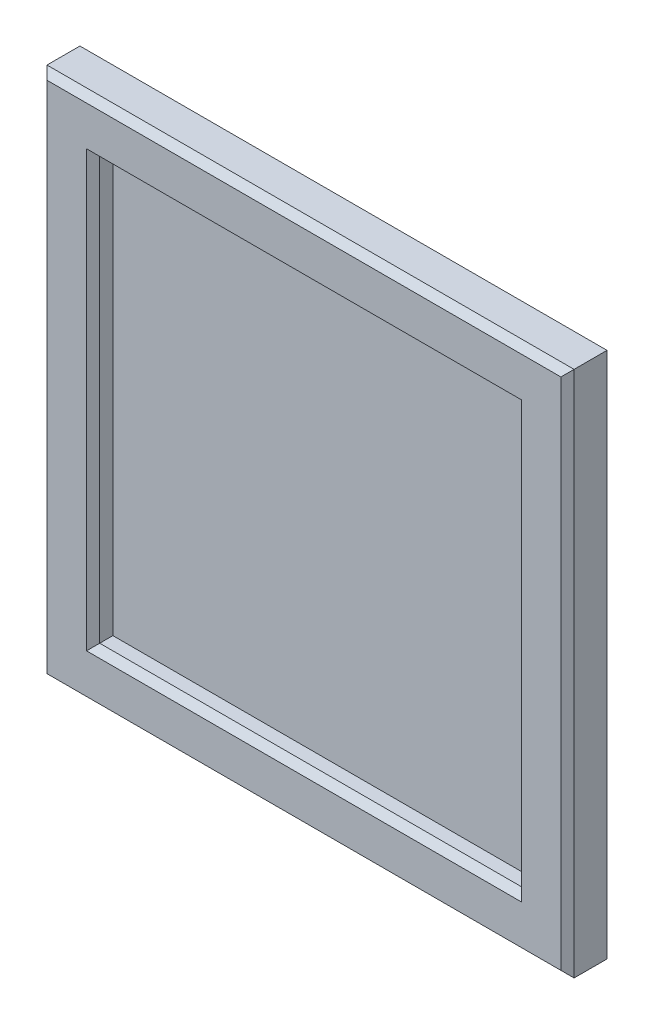
ISO-10303-21;
HEADER;
FILE_DESCRIPTION(('STEP AP214'),'2;1');
FILE_NAME('part.step','',(''),(''),'','','');
FILE_SCHEMA(('AUTOMOTIVE_DESIGN { 1 0 10303 214 1 1 1 1 }'));
ENDSEC;
DATA;
#1=APPLICATION_CONTEXT('core data for automotive mechanical design processes');
#2=APPLICATION_PROTOCOL_DEFINITION('international standard','automotive_design',2000,#1);
#3=PRODUCT_CONTEXT('',#1,'mechanical');
#4=PRODUCT('Part','Part','',(#3));
#5=PRODUCT_RELATED_PRODUCT_CATEGORY('part','',(#4));
#6=PRODUCT_DEFINITION_FORMATION('','',#4);
#7=PRODUCT_DEFINITION_CONTEXT('part definition',#1,'design');
#8=PRODUCT_DEFINITION('design','',#6,#7);
#9=PRODUCT_DEFINITION_SHAPE('','',#8);
#10=(LENGTH_UNIT() NAMED_UNIT(*) SI_UNIT(.MILLI.,.METRE.));
#11=(NAMED_UNIT(*) PLANE_ANGLE_UNIT() SI_UNIT($,.RADIAN.));
#12=(NAMED_UNIT(*) SI_UNIT($,.STERADIAN.) SOLID_ANGLE_UNIT());
#13=UNCERTAINTY_MEASURE_WITH_UNIT(LENGTH_MEASURE(1.E-05),#10,'distance_accuracy_value','');
#14=(GEOMETRIC_REPRESENTATION_CONTEXT(3) GLOBAL_UNCERTAINTY_ASSIGNED_CONTEXT((#13)) GLOBAL_UNIT_ASSIGNED_CONTEXT((#10,
#11,#12)) REPRESENTATION_CONTEXT('',''));
#15=CARTESIAN_POINT('',(0.,0.,0.));
#16=DIRECTION('',(0.,0.,1.));
#17=DIRECTION('',(1.,0.,0.));
#18=AXIS2_PLACEMENT_3D('',#15,#16,#17);
#19=CARTESIAN_POINT('',(752.924621398334,752.055348931836,30.));
#20=DIRECTION('',(1.,0.,0.));
#21=DIRECTION('',(0.,0.,-1.));
#22=AXIS2_PLACEMENT_3D('',#19,#20,#21);
#23=PLANE('',#22);
#24=DIRECTION('',(0.,-1.,0.));
#25=VECTOR('',#24,1.);
#26=CARTESIAN_POINT('',(752.924621398334,752.055348931836,20.));
#27=LINE('',#26,#25);
#28=CARTESIAN_POINT('',(752.924621398334,752.055348931836,20.));
#29=VERTEX_POINT('',#28);
#30=CARTESIAN_POINT('',(752.924621398334,37.5133814701847,20.));
#31=VERTEX_POINT('',#30);
#32=EDGE_CURVE('E121',#29,#31,#27,.T.);
#33=ORIENTED_EDGE('',*,*,#32,.F.);
#34=DIRECTION('',(0.,0.,-1.));
#35=VECTOR('',#34,1.);
#36=CARTESIAN_POINT('',(752.924621398334,752.055348931836,30.));
#37=LINE('',#36,#35);
#38=CARTESIAN_POINT('',(752.924621398334,752.055348931836,30.));
#39=VERTEX_POINT('',#38);
#40=EDGE_CURVE('E12',#39,#29,#37,.T.);
#41=ORIENTED_EDGE('',*,*,#40,.F.);
#42=DIRECTION('',(0.,-1.,0.));
#43=VECTOR('',#42,1.);
#44=CARTESIAN_POINT('',(752.924621398334,752.055348931836,30.));
#45=LINE('',#44,#43);
#46=CARTESIAN_POINT('',(752.924621398334,37.5133814701847,30.));
#47=VERTEX_POINT('',#46);
#48=EDGE_CURVE('E115',#39,#47,#45,.T.);
#49=ORIENTED_EDGE('',*,*,#48,.T.);
#50=DIRECTION('',(0.,0.,-1.));
#51=VECTOR('',#50,1.);
#52=CARTESIAN_POINT('',(752.924621398334,37.5133814701847,30.));
#53=LINE('',#52,#51);
#54=EDGE_CURVE('E60',#47,#31,#53,.T.);
#55=ORIENTED_EDGE('',*,*,#54,.T.);
#56=EDGE_LOOP('',(#33,#41,#49,#55));
#57=FACE_BOUND('',#56,.T.);
#58=ADVANCED_FACE('F57',(#57),#23,.T.);
#59=CARTESIAN_POINT('',(752.924621398334,752.055348931836,30.));
#60=DIRECTION('',(0.,1.,0.));
#61=DIRECTION('',(0.,0.,1.));
#62=AXIS2_PLACEMENT_3D('',#59,#60,#61);
#63=PLANE('',#62);
#64=DIRECTION('',(1.,0.,0.));
#65=VECTOR('',#64,1.);
#66=CARTESIAN_POINT('',(752.924621398334,752.055348931836,20.));
#67=LINE('',#66,#65);
#68=CARTESIAN_POINT('',(41.8597438026764,752.055348931836,20.));
#69=VERTEX_POINT('',#68);
#70=EDGE_CURVE('E117',#69,#29,#67,.T.);
#71=ORIENTED_EDGE('',*,*,#70,.F.);
#72=DIRECTION('',(0.,0.,-1.));
#73=VECTOR('',#72,1.);
#74=CARTESIAN_POINT('',(41.8597438026764,752.055348931836,30.));
#75=LINE('',#74,#73);
#76=CARTESIAN_POINT('',(41.8597438026764,752.055348931836,30.));
#77=VERTEX_POINT('',#76);
#78=EDGE_CURVE('E66',#77,#69,#75,.T.);
#79=ORIENTED_EDGE('',*,*,#78,.F.);
#80=DIRECTION('',(1.,0.,0.));
#81=VECTOR('',#80,1.);
#82=CARTESIAN_POINT('',(752.924621398334,752.055348931836,30.));
#83=LINE('',#82,#81);
#84=EDGE_CURVE('E112',#77,#39,#83,.T.);
#85=ORIENTED_EDGE('',*,*,#84,.T.);
#86=ORIENTED_EDGE('',*,*,#40,.T.);
#87=EDGE_LOOP('',(#71,#79,#85,#86));
#88=FACE_BOUND('',#87,.T.);
#89=ADVANCED_FACE('F131',(#88),#63,.T.);
#90=CARTESIAN_POINT('',(41.8597438026764,752.055348931836,30.));
#91=DIRECTION('',(-1.,0.,0.));
#92=DIRECTION('',(0.,0.,1.));
#93=AXIS2_PLACEMENT_3D('',#90,#91,#92);
#94=PLANE('',#93);
#95=DIRECTION('',(0.,1.,0.));
#96=VECTOR('',#95,1.);
#97=CARTESIAN_POINT('',(41.8597438026764,752.055348931836,20.));
#98=LINE('',#97,#96);
#99=CARTESIAN_POINT('',(41.8597438026764,37.5133814701847,20.));
#100=VERTEX_POINT('',#99);
#101=EDGE_CURVE('E107',#100,#69,#98,.T.);
#102=ORIENTED_EDGE('',*,*,#101,.F.);
#103=DIRECTION('',(0.,0.,-1.));
#104=VECTOR('',#103,1.);
#105=CARTESIAN_POINT('',(41.8597438026764,37.5133814701847,30.));
#106=LINE('',#105,#104);
#107=CARTESIAN_POINT('',(41.8597438026764,37.5133814701847,30.));
#108=VERTEX_POINT('',#107);
#109=EDGE_CURVE('E102',#108,#100,#106,.T.);
#110=ORIENTED_EDGE('',*,*,#109,.F.);
#111=DIRECTION('',(0.,1.,0.));
#112=VECTOR('',#111,1.);
#113=CARTESIAN_POINT('',(41.8597438026764,752.055348931836,30.));
#114=LINE('',#113,#112);
#115=EDGE_CURVE('E105',#108,#77,#114,.T.);
#116=ORIENTED_EDGE('',*,*,#115,.T.);
#117=ORIENTED_EDGE('',*,*,#78,.T.);
#118=EDGE_LOOP('',(#102,#110,#116,#117));
#119=FACE_BOUND('',#118,.T.);
#120=ADVANCED_FACE('F104',(#119),#94,.T.);
#121=CARTESIAN_POINT('',(752.924621398334,37.5133814701847,30.));
#122=DIRECTION('',(0.,-1.,0.));
#123=DIRECTION('',(0.,0.,-1.));
#124=AXIS2_PLACEMENT_3D('',#121,#122,#123);
#125=PLANE('',#124);
#126=DIRECTION('',(-1.,0.,0.));
#127=VECTOR('',#126,1.);
#128=CARTESIAN_POINT('',(752.924621398334,37.5133814701847,20.));
#129=LINE('',#128,#127);
#130=EDGE_CURVE('E124',#31,#100,#129,.T.);
#131=ORIENTED_EDGE('',*,*,#130,.F.);
#132=ORIENTED_EDGE('',*,*,#54,.F.);
#133=DIRECTION('',(-1.,0.,0.));
#134=VECTOR('',#133,1.);
#135=CARTESIAN_POINT('',(752.924621398334,37.5133814701847,30.));
#136=LINE('',#135,#134);
#137=EDGE_CURVE('E111',#47,#108,#136,.T.);
#138=ORIENTED_EDGE('',*,*,#137,.T.);
#139=ORIENTED_EDGE('',*,*,#109,.T.);
#140=EDGE_LOOP('',(#131,#132,#138,#139));
#141=FACE_BOUND('',#140,.T.);
#142=ADVANCED_FACE('F114',(#141),#125,.T.);
#143=CARTESIAN_POINT('',(0.,0.,30.));
#144=DIRECTION('',(0.,0.,-1.));
#145=DIRECTION('',(-1.,0.,0.));
#146=AXIS2_PLACEMENT_3D('',#143,#144,#145);
#147=PLANE('',#146);
#148=ORIENTED_EDGE('',*,*,#48,.F.);
#149=ORIENTED_EDGE('',*,*,#84,.F.);
#150=ORIENTED_EDGE('',*,*,#115,.F.);
#151=ORIENTED_EDGE('',*,*,#137,.F.);
#152=EDGE_LOOP('',(#148,#149,#150,#151));
#153=FACE_BOUND('',#152,.T.);
#154=ADVANCED_FACE('F110',(#153),#147,.F.);
#155=CARTESIAN_POINT('',(0.,0.,20.));
#156=DIRECTION('',(0.,0.,-1.));
#157=DIRECTION('',(-1.,0.,0.));
#158=AXIS2_PLACEMENT_3D('',#155,#156,#157);
#159=PLANE('',#158);
#160=ORIENTED_EDGE('',*,*,#32,.T.);
#161=ORIENTED_EDGE('',*,*,#130,.T.);
#162=ORIENTED_EDGE('',*,*,#101,.T.);
#163=ORIENTED_EDGE('',*,*,#70,.T.);
#164=EDGE_LOOP('',(#160,#161,#162,#163));
#165=FACE_BOUND('',#164,.T.);
#166=ADVANCED_FACE('F130',(#165),#159,.T.);
#167=CLOSED_SHELL('',(#58,#89,#120,#142,#154,#166));
#168=MANIFOLD_SOLID_BREP('B2',#167);
#169=CARTESIAN_POINT('',(0.,0.,60.));
#170=DIRECTION('',(0.,0.,-1.));
#171=DIRECTION('',(-1.,0.,0.));
#172=AXIS2_PLACEMENT_3D('',#169,#170,#171);
#173=PLANE('',#172);
#174=DIRECTION('',(1.,0.,0.));
#175=VECTOR('',#174,1.);
#176=CARTESIAN_POINT('',(720.,730.,60.));
#177=LINE('',#176,#175);
#178=CARTESIAN_POINT('',(70.,730.,60.));
#179=VERTEX_POINT('',#178);
#180=CARTESIAN_POINT('',(730.,730.,60.));
#181=VERTEX_POINT('',#180);
#182=EDGE_CURVE('E346',#179,#181,#177,.T.);
#183=ORIENTED_EDGE('',*,*,#182,.T.);
#184=DIRECTION('',(0.,-1.,0.));
#185=VECTOR('',#184,1.);
#186=CARTESIAN_POINT('',(730.,80.,60.));
#187=LINE('',#186,#185);
#188=CARTESIAN_POINT('',(730.,70.,60.));
#189=VERTEX_POINT('',#188);
#190=EDGE_CURVE('E348',#181,#189,#187,.T.);
#191=ORIENTED_EDGE('',*,*,#190,.T.);
#192=DIRECTION('',(-1.,0.,0.));
#193=VECTOR('',#192,1.);
#194=CARTESIAN_POINT('',(80.,70.,60.));
#195=LINE('',#194,#193);
#196=CARTESIAN_POINT('',(70.,70.,60.));
#197=VERTEX_POINT('',#196);
#198=EDGE_CURVE('E342',#189,#197,#195,.T.);
#199=ORIENTED_EDGE('',*,*,#198,.T.);
#200=DIRECTION('',(0.,1.,0.));
#201=VECTOR('',#200,1.);
#202=CARTESIAN_POINT('',(70.,720.,60.));
#203=LINE('',#202,#201);
#204=EDGE_CURVE('E344',#197,#179,#203,.T.);
#205=ORIENTED_EDGE('',*,*,#204,.T.);
#206=EDGE_LOOP('',(#183,#191,#199,#205));
#207=FACE_BOUND('',#206,.T.);
#208=DIRECTION('',(0.,1.,0.));
#209=VECTOR('',#208,1.);
#210=CARTESIAN_POINT('',(790.,0.,60.));
#211=LINE('',#210,#209);
#212=CARTESIAN_POINT('',(790.,10.,60.));
#213=VERTEX_POINT('',#212);
#214=CARTESIAN_POINT('',(790.,790.,60.));
#215=VERTEX_POINT('',#214);
#216=EDGE_CURVE('E337',#213,#215,#211,.T.);
#217=ORIENTED_EDGE('',*,*,#216,.T.);
#218=DIRECTION('',(-1.,0.,0.));
#219=VECTOR('',#218,1.);
#220=CARTESIAN_POINT('',(0.,790.,60.));
#221=LINE('',#220,#219);
#222=CARTESIAN_POINT('',(10.,790.,60.));
#223=VERTEX_POINT('',#222);
#224=EDGE_CURVE('E339',#215,#223,#221,.T.);
#225=ORIENTED_EDGE('',*,*,#224,.T.);
#226=DIRECTION('',(0.,-1.,0.));
#227=VECTOR('',#226,1.);
#228=CARTESIAN_POINT('',(10.,0.,60.));
#229=LINE('',#228,#227);
#230=CARTESIAN_POINT('',(10.,10.,60.));
#231=VERTEX_POINT('',#230);
#232=EDGE_CURVE('E333',#223,#231,#229,.T.);
#233=ORIENTED_EDGE('',*,*,#232,.T.);
#234=DIRECTION('',(1.,0.,0.));
#235=VECTOR('',#234,1.);
#236=CARTESIAN_POINT('',(0.,10.,60.));
#237=LINE('',#236,#235);
#238=EDGE_CURVE('E335',#231,#213,#237,.T.);
#239=ORIENTED_EDGE('',*,*,#238,.T.);
#240=EDGE_LOOP('',(#217,#225,#233,#239));
#241=FACE_BOUND('',#240,.T.);
#242=ADVANCED_FACE('F181',(#207,#241),#173,.F.);
#243=CARTESIAN_POINT('',(0.,0.,0.));
#244=DIRECTION('',(0.,0.,-1.));
#245=DIRECTION('',(-1.,0.,0.));
#246=AXIS2_PLACEMENT_3D('',#243,#244,#245);
#247=PLANE('',#246);
#248=DIRECTION('',(0.,-1.,0.));
#249=VECTOR('',#248,1.);
#250=CARTESIAN_POINT('',(0.,0.,0.));
#251=LINE('',#250,#249);
#252=CARTESIAN_POINT('',(0.,800.,0.));
#253=VERTEX_POINT('',#252);
#254=CARTESIAN_POINT('',(0.,0.,0.));
#255=VERTEX_POINT('',#254);
#256=EDGE_CURVE('E284',#253,#255,#251,.T.);
#257=ORIENTED_EDGE('',*,*,#256,.F.);
#258=DIRECTION('',(-1.,0.,0.));
#259=VECTOR('',#258,1.);
#260=CARTESIAN_POINT('',(0.,800.,0.));
#261=LINE('',#260,#259);
#262=CARTESIAN_POINT('',(800.,800.,0.));
#263=VERTEX_POINT('',#262);
#264=EDGE_CURVE('E320',#263,#253,#261,.T.);
#265=ORIENTED_EDGE('',*,*,#264,.F.);
#266=DIRECTION('',(0.,1.,0.));
#267=VECTOR('',#266,1.);
#268=CARTESIAN_POINT('',(800.,0.,0.));
#269=LINE('',#268,#267);
#270=CARTESIAN_POINT('',(800.,0.,0.));
#271=VERTEX_POINT('',#270);
#272=EDGE_CURVE('E317',#271,#263,#269,.T.);
#273=ORIENTED_EDGE('',*,*,#272,.F.);
#274=DIRECTION('',(1.,0.,0.));
#275=VECTOR('',#274,1.);
#276=CARTESIAN_POINT('',(0.,0.,0.));
#277=LINE('',#276,#275);
#278=EDGE_CURVE('E314',#255,#271,#277,.T.);
#279=ORIENTED_EDGE('',*,*,#278,.F.);
#280=EDGE_LOOP('',(#257,#265,#273,#279));
#281=FACE_BOUND('',#280,.T.);
#282=DIRECTION('',(0.,-1.,0.));
#283=VECTOR('',#282,1.);
#284=CARTESIAN_POINT('',(80.,80.,0.));
#285=LINE('',#284,#283);
#286=CARTESIAN_POINT('',(80.,720.,0.));
#287=VERTEX_POINT('',#286);
#288=CARTESIAN_POINT('',(80.,80.,0.));
#289=VERTEX_POINT('',#288);
#290=EDGE_CURVE('E298',#287,#289,#285,.T.);
#291=ORIENTED_EDGE('',*,*,#290,.T.);
#292=DIRECTION('',(1.,0.,0.));
#293=VECTOR('',#292,1.);
#294=CARTESIAN_POINT('',(80.,80.,0.));
#295=LINE('',#294,#293);
#296=CARTESIAN_POINT('',(720.,80.,0.));
#297=VERTEX_POINT('',#296);
#298=EDGE_CURVE('E277',#289,#297,#295,.T.);
#299=ORIENTED_EDGE('',*,*,#298,.T.);
#300=DIRECTION('',(0.,1.,0.));
#301=VECTOR('',#300,1.);
#302=CARTESIAN_POINT('',(720.,80.,0.));
#303=LINE('',#302,#301);
#304=CARTESIAN_POINT('',(720.,720.,0.));
#305=VERTEX_POINT('',#304);
#306=EDGE_CURVE('E288',#297,#305,#303,.T.);
#307=ORIENTED_EDGE('',*,*,#306,.T.);
#308=DIRECTION('',(-1.,0.,0.));
#309=VECTOR('',#308,1.);
#310=CARTESIAN_POINT('',(80.,720.,0.));
#311=LINE('',#310,#309);
#312=EDGE_CURVE('E294',#305,#287,#311,.T.);
#313=ORIENTED_EDGE('',*,*,#312,.T.);
#314=EDGE_LOOP('',(#291,#299,#307,#313));
#315=FACE_BOUND('',#314,.T.);
#316=ADVANCED_FACE('F296',(#281,#315),#247,.T.);
#317=CARTESIAN_POINT('',(0.,0.,60.));
#318=DIRECTION('',(1.,0.,0.));
#319=DIRECTION('',(0.,0.,-1.));
#320=AXIS2_PLACEMENT_3D('',#317,#318,#319);
#321=PLANE('',#320);
#322=DIRECTION('',(0.,0.,-1.));
#323=VECTOR('',#322,1.);
#324=CARTESIAN_POINT('',(0.,0.,60.));
#325=LINE('',#324,#323);
#326=CARTESIAN_POINT('',(0.,0.,49.9999999999999));
#327=VERTEX_POINT('',#326);
#328=EDGE_CURVE('E329',#327,#255,#325,.T.);
#329=ORIENTED_EDGE('',*,*,#328,.F.);
#330=DIRECTION('',(0.,1.,0.));
#331=VECTOR('',#330,1.);
#332=CARTESIAN_POINT('',(0.,0.,49.9999999999999));
#333=LINE('',#332,#331);
#334=CARTESIAN_POINT('',(0.,800.,49.9999999999999));
#335=VERTEX_POINT('',#334);
#336=EDGE_CURVE('E55',#327,#335,#333,.T.);
#337=ORIENTED_EDGE('',*,*,#336,.T.);
#338=DIRECTION('',(0.,0.,-1.));
#339=VECTOR('',#338,1.);
#340=CARTESIAN_POINT('',(0.,800.,60.));
#341=LINE('',#340,#339);
#342=EDGE_CURVE('E323',#335,#253,#341,.T.);
#343=ORIENTED_EDGE('',*,*,#342,.T.);
#344=ORIENTED_EDGE('',*,*,#256,.T.);
#345=EDGE_LOOP('',(#329,#337,#343,#344));
#346=FACE_BOUND('',#345,.T.);
#347=ADVANCED_FACE('F388',(#346),#321,.F.);
#348=CARTESIAN_POINT('',(0.,0.,60.));
#349=DIRECTION('',(0.,1.,0.));
#350=DIRECTION('',(0.,0.,1.));
#351=AXIS2_PLACEMENT_3D('',#348,#349,#350);
#352=PLANE('',#351);
#353=DIRECTION('',(0.,0.,-1.));
#354=VECTOR('',#353,1.);
#355=CARTESIAN_POINT('',(800.,0.,60.));
#356=LINE('',#355,#354);
#357=CARTESIAN_POINT('',(800.,0.,49.9999999999999));
#358=VERTEX_POINT('',#357);
#359=EDGE_CURVE('E327',#358,#271,#356,.T.);
#360=ORIENTED_EDGE('',*,*,#359,.F.);
#361=DIRECTION('',(-1.,0.,0.));
#362=VECTOR('',#361,1.);
#363=CARTESIAN_POINT('',(0.,0.,49.9999999999999));
#364=LINE('',#363,#362);
#365=EDGE_CURVE('E191',#358,#327,#364,.T.);
#366=ORIENTED_EDGE('',*,*,#365,.T.);
#367=ORIENTED_EDGE('',*,*,#328,.T.);
#368=ORIENTED_EDGE('',*,*,#278,.T.);
#369=EDGE_LOOP('',(#360,#366,#367,#368));
#370=FACE_BOUND('',#369,.T.);
#371=ADVANCED_FACE('F415',(#370),#352,.F.);
#372=CARTESIAN_POINT('',(800.,0.,60.));
#373=DIRECTION('',(-1.,0.,0.));
#374=DIRECTION('',(0.,0.,1.));
#375=AXIS2_PLACEMENT_3D('',#372,#373,#374);
#376=PLANE('',#375);
#377=DIRECTION('',(0.,0.,-1.));
#378=VECTOR('',#377,1.);
#379=CARTESIAN_POINT('',(800.,800.,60.));
#380=LINE('',#379,#378);
#381=CARTESIAN_POINT('',(800.,800.,49.9999999999999));
#382=VERTEX_POINT('',#381);
#383=EDGE_CURVE('E325',#382,#263,#380,.T.);
#384=ORIENTED_EDGE('',*,*,#383,.F.);
#385=DIRECTION('',(0.,-1.,0.));
#386=VECTOR('',#385,1.);
#387=CARTESIAN_POINT('',(800.,0.,49.9999999999999));
#388=LINE('',#387,#386);
#389=EDGE_CURVE('E206',#382,#358,#388,.T.);
#390=ORIENTED_EDGE('',*,*,#389,.T.);
#391=ORIENTED_EDGE('',*,*,#359,.T.);
#392=ORIENTED_EDGE('',*,*,#272,.T.);
#393=EDGE_LOOP('',(#384,#390,#391,#392));
#394=FACE_BOUND('',#393,.T.);
#395=ADVANCED_FACE('F412',(#394),#376,.F.);
#396=CARTESIAN_POINT('',(0.,800.,60.));
#397=DIRECTION('',(0.,-1.,0.));
#398=DIRECTION('',(0.,0.,-1.));
#399=AXIS2_PLACEMENT_3D('',#396,#397,#398);
#400=PLANE('',#399);
#401=ORIENTED_EDGE('',*,*,#342,.F.);
#402=DIRECTION('',(1.,0.,0.));
#403=VECTOR('',#402,1.);
#404=CARTESIAN_POINT('',(0.,800.,49.9999999999999));
#405=LINE('',#404,#403);
#406=EDGE_CURVE('E356',#335,#382,#405,.T.);
#407=ORIENTED_EDGE('',*,*,#406,.T.);
#408=ORIENTED_EDGE('',*,*,#383,.T.);
#409=ORIENTED_EDGE('',*,*,#264,.T.);
#410=EDGE_LOOP('',(#401,#407,#408,#409));
#411=FACE_BOUND('',#410,.T.);
#412=ADVANCED_FACE('F391',(#411),#400,.F.);
#413=CARTESIAN_POINT('',(80.,80.,60.));
#414=DIRECTION('',(0.,1.,0.));
#415=DIRECTION('',(0.,0.,1.));
#416=AXIS2_PLACEMENT_3D('',#413,#414,#415);
#417=PLANE('',#416);
#418=DIRECTION('',(0.,0.,-1.));
#419=VECTOR('',#418,1.);
#420=CARTESIAN_POINT('',(80.,80.,60.));
#421=LINE('',#420,#419);
#422=CARTESIAN_POINT('',(80.,80.,50.));
#423=VERTEX_POINT('',#422);
#424=EDGE_CURVE('E307',#423,#289,#421,.T.);
#425=ORIENTED_EDGE('',*,*,#424,.F.);
#426=DIRECTION('',(1.,0.,0.));
#427=VECTOR('',#426,1.);
#428=CARTESIAN_POINT('',(720.,80.,50.));
#429=LINE('',#428,#427);
#430=CARTESIAN_POINT('',(720.,80.,50.));
#431=VERTEX_POINT('',#430);
#432=EDGE_CURVE('E280',#423,#431,#429,.T.);
#433=ORIENTED_EDGE('',*,*,#432,.T.);
#434=DIRECTION('',(0.,0.,-1.));
#435=VECTOR('',#434,1.);
#436=CARTESIAN_POINT('',(720.,80.,60.));
#437=LINE('',#436,#435);
#438=EDGE_CURVE('E272',#431,#297,#437,.T.);
#439=ORIENTED_EDGE('',*,*,#438,.T.);
#440=ORIENTED_EDGE('',*,*,#298,.F.);
#441=EDGE_LOOP('',(#425,#433,#439,#440));
#442=FACE_BOUND('',#441,.T.);
#443=ADVANCED_FACE('F275',(#442),#417,.T.);
#444=CARTESIAN_POINT('',(720.,80.,60.));
#445=DIRECTION('',(-1.,0.,0.));
#446=DIRECTION('',(0.,0.,1.));
#447=AXIS2_PLACEMENT_3D('',#444,#445,#446);
#448=PLANE('',#447);
#449=ORIENTED_EDGE('',*,*,#438,.F.);
#450=DIRECTION('',(0.,1.,0.));
#451=VECTOR('',#450,1.);
#452=CARTESIAN_POINT('',(720.,720.,50.));
#453=LINE('',#452,#451);
#454=CARTESIAN_POINT('',(720.,720.,50.));
#455=VERTEX_POINT('',#454);
#456=EDGE_CURVE('E331',#431,#455,#453,.T.);
#457=ORIENTED_EDGE('',*,*,#456,.T.);
#458=DIRECTION('',(0.,0.,-1.));
#459=VECTOR('',#458,1.);
#460=CARTESIAN_POINT('',(720.,720.,60.));
#461=LINE('',#460,#459);
#462=EDGE_CURVE('E285',#455,#305,#461,.T.);
#463=ORIENTED_EDGE('',*,*,#462,.T.);
#464=ORIENTED_EDGE('',*,*,#306,.F.);
#465=EDGE_LOOP('',(#449,#457,#463,#464));
#466=FACE_BOUND('',#465,.T.);
#467=ADVANCED_FACE('F289',(#466),#448,.T.);
#468=CARTESIAN_POINT('',(80.,720.,60.));
#469=DIRECTION('',(0.,-1.,0.));
#470=DIRECTION('',(0.,0.,-1.));
#471=AXIS2_PLACEMENT_3D('',#468,#469,#470);
#472=PLANE('',#471);
#473=ORIENTED_EDGE('',*,*,#462,.F.);
#474=DIRECTION('',(-1.,0.,0.));
#475=VECTOR('',#474,1.);
#476=CARTESIAN_POINT('',(80.,720.,50.));
#477=LINE('',#476,#475);
#478=CARTESIAN_POINT('',(80.,720.,50.));
#479=VERTEX_POINT('',#478);
#480=EDGE_CURVE('E351',#455,#479,#477,.T.);
#481=ORIENTED_EDGE('',*,*,#480,.T.);
#482=DIRECTION('',(0.,0.,-1.));
#483=VECTOR('',#482,1.);
#484=CARTESIAN_POINT('',(80.,720.,60.));
#485=LINE('',#484,#483);
#486=EDGE_CURVE('E309',#479,#287,#485,.T.);
#487=ORIENTED_EDGE('',*,*,#486,.T.);
#488=ORIENTED_EDGE('',*,*,#312,.F.);
#489=EDGE_LOOP('',(#473,#481,#487,#488));
#490=FACE_BOUND('',#489,.T.);
#491=ADVANCED_FACE('F493',(#490),#472,.T.);
#492=CARTESIAN_POINT('',(80.,80.,60.));
#493=DIRECTION('',(1.,0.,0.));
#494=DIRECTION('',(0.,0.,-1.));
#495=AXIS2_PLACEMENT_3D('',#492,#493,#494);
#496=PLANE('',#495);
#497=ORIENTED_EDGE('',*,*,#486,.F.);
#498=DIRECTION('',(0.,-1.,0.));
#499=VECTOR('',#498,1.);
#500=CARTESIAN_POINT('',(80.,80.,50.));
#501=LINE('',#500,#499);
#502=EDGE_CURVE('E353',#479,#423,#501,.T.);
#503=ORIENTED_EDGE('',*,*,#502,.T.);
#504=ORIENTED_EDGE('',*,*,#424,.T.);
#505=ORIENTED_EDGE('',*,*,#290,.F.);
#506=EDGE_LOOP('',(#497,#503,#504,#505));
#507=FACE_BOUND('',#506,.T.);
#508=ADVANCED_FACE('F446',(#507),#496,.T.);
#509=CARTESIAN_POINT('',(80.,80.,50.));
#510=DIRECTION('',(0.707106781186547,0.,0.707106781186547));
#511=DIRECTION('',(0.,1.,0.));
#512=AXIS2_PLACEMENT_3D('',#509,#510,#511);
#513=PLANE('',#512);
#514=DIRECTION('',(-0.577350269189626,0.577350269189626,0.577350269189626));
#515=VECTOR('',#514,1.);
#516=CARTESIAN_POINT('',(80.,720.,50.));
#517=LINE('',#516,#515);
#518=EDGE_CURVE('E302',#179,#479,#517,.F.);
#519=ORIENTED_EDGE('',*,*,#518,.F.);
#520=ORIENTED_EDGE('',*,*,#204,.F.);
#521=DIRECTION('',(-0.577350269189626,-0.577350269189626,0.577350269189626));
#522=VECTOR('',#521,1.);
#523=CARTESIAN_POINT('',(80.,80.,50.));
#524=LINE('',#523,#522);
#525=EDGE_CURVE('E299',#423,#197,#524,.T.);
#526=ORIENTED_EDGE('',*,*,#525,.F.);
#527=ORIENTED_EDGE('',*,*,#502,.F.);
#528=EDGE_LOOP('',(#519,#520,#526,#527));
#529=FACE_BOUND('',#528,.T.);
#530=ADVANCED_FACE('F440',(#529),#513,.T.);
#531=CARTESIAN_POINT('',(80.,80.,50.));
#532=DIRECTION('',(0.,0.707106781186547,0.707106781186547));
#533=DIRECTION('',(-1.,0.,0.));
#534=AXIS2_PLACEMENT_3D('',#531,#532,#533);
#535=PLANE('',#534);
#536=ORIENTED_EDGE('',*,*,#525,.T.);
#537=ORIENTED_EDGE('',*,*,#198,.F.);
#538=DIRECTION('',(-0.577350269189626,0.577350269189626,-0.577350269189626));
#539=VECTOR('',#538,1.);
#540=CARTESIAN_POINT('',(720.,80.,50.));
#541=LINE('',#540,#539);
#542=EDGE_CURVE('E363',#431,#189,#541,.F.);
#543=ORIENTED_EDGE('',*,*,#542,.F.);
#544=ORIENTED_EDGE('',*,*,#432,.F.);
#545=EDGE_LOOP('',(#536,#537,#543,#544));
#546=FACE_BOUND('',#545,.T.);
#547=ADVANCED_FACE('F433',(#546),#535,.T.);
#548=CARTESIAN_POINT('',(80.,720.,50.));
#549=DIRECTION('',(0.,-0.707106781186547,0.707106781186547));
#550=DIRECTION('',(1.,0.,0.));
#551=AXIS2_PLACEMENT_3D('',#548,#549,#550);
#552=PLANE('',#551);
#553=ORIENTED_EDGE('',*,*,#518,.T.);
#554=ORIENTED_EDGE('',*,*,#480,.F.);
#555=DIRECTION('',(0.577350269189626,0.577350269189626,0.577350269189626));
#556=VECTOR('',#555,1.);
#557=CARTESIAN_POINT('',(506.666666666667,506.666666666667,-163.333333333333));
#558=LINE('',#557,#556);
#559=EDGE_CURVE('E361',#181,#455,#558,.F.);
#560=ORIENTED_EDGE('',*,*,#559,.F.);
#561=ORIENTED_EDGE('',*,*,#182,.F.);
#562=EDGE_LOOP('',(#553,#554,#560,#561));
#563=FACE_BOUND('',#562,.T.);
#564=ADVANCED_FACE('F426',(#563),#552,.T.);
#565=CARTESIAN_POINT('',(720.,80.,50.));
#566=DIRECTION('',(-0.707106781186547,0.,0.707106781186547));
#567=DIRECTION('',(0.,-1.,0.));
#568=AXIS2_PLACEMENT_3D('',#565,#566,#567);
#569=PLANE('',#568);
#570=ORIENTED_EDGE('',*,*,#542,.T.);
#571=ORIENTED_EDGE('',*,*,#190,.F.);
#572=ORIENTED_EDGE('',*,*,#559,.T.);
#573=ORIENTED_EDGE('',*,*,#456,.F.);
#574=EDGE_LOOP('',(#570,#571,#572,#573));
#575=FACE_BOUND('',#574,.T.);
#576=ADVANCED_FACE('F420',(#575),#569,.T.);
#577=CARTESIAN_POINT('',(0.,10.,60.));
#578=DIRECTION('',(0.,0.707106781186552,-0.707106781186543));
#579=DIRECTION('',(1.,0.,0.));
#580=AXIS2_PLACEMENT_3D('',#577,#578,#579);
#581=PLANE('',#580);
#582=DIRECTION('',(0.577350269189624,0.577350269189624,0.57735026918963));
#583=VECTOR('',#582,1.);
#584=CARTESIAN_POINT('',(6.66666666666669,6.6666666666667,56.6666666666667));
#585=LINE('',#584,#583);
#586=EDGE_CURVE('E370',#327,#231,#585,.T.);
#587=ORIENTED_EDGE('',*,*,#586,.F.);
#588=ORIENTED_EDGE('',*,*,#365,.F.);
#589=DIRECTION('',(-0.577350269189624,0.577350269189624,0.57735026918963));
#590=VECTOR('',#589,1.);
#591=CARTESIAN_POINT('',(526.666666666668,273.333333333331,323.333333333334));
#592=LINE('',#591,#590);
#593=EDGE_CURVE('E186',#213,#358,#592,.F.);
#594=ORIENTED_EDGE('',*,*,#593,.F.);
#595=ORIENTED_EDGE('',*,*,#238,.F.);
#596=EDGE_LOOP('',(#587,#588,#594,#595));
#597=FACE_BOUND('',#596,.T.);
#598=ADVANCED_FACE('F184',(#597),#581,.F.);
#599=CARTESIAN_POINT('',(790.,0.,60.));
#600=DIRECTION('',(-0.707106781186551,0.,-0.707106781186543));
#601=DIRECTION('',(0.,1.,0.));
#602=AXIS2_PLACEMENT_3D('',#599,#600,#601);
#603=PLANE('',#602);
#604=ORIENTED_EDGE('',*,*,#593,.T.);
#605=ORIENTED_EDGE('',*,*,#389,.F.);
#606=DIRECTION('',(-0.577350269189624,-0.577350269189624,0.57735026918963));
#607=VECTOR('',#606,1.);
#608=CARTESIAN_POINT('',(526.666666666669,526.666666666669,323.333333333334));
#609=LINE('',#608,#607);
#610=EDGE_CURVE('E369',#215,#382,#609,.F.);
#611=ORIENTED_EDGE('',*,*,#610,.F.);
#612=ORIENTED_EDGE('',*,*,#216,.F.);
#613=EDGE_LOOP('',(#604,#605,#611,#612));
#614=FACE_BOUND('',#613,.T.);
#615=ADVANCED_FACE('F380',(#614),#603,.F.);
#616=CARTESIAN_POINT('',(10.,0.,60.));
#617=DIRECTION('',(0.707106781186552,0.,-0.707106781186543));
#618=DIRECTION('',(0.,-1.,0.));
#619=AXIS2_PLACEMENT_3D('',#616,#617,#618);
#620=PLANE('',#619);
#621=ORIENTED_EDGE('',*,*,#586,.T.);
#622=ORIENTED_EDGE('',*,*,#232,.F.);
#623=DIRECTION('',(-0.577350269189624,0.577350269189624,-0.57735026918963));
#624=VECTOR('',#623,1.);
#625=CARTESIAN_POINT('',(273.333333333331,526.666666666668,323.333333333334));
#626=LINE('',#625,#624);
#627=EDGE_CURVE('E367',#335,#223,#626,.F.);
#628=ORIENTED_EDGE('',*,*,#627,.F.);
#629=ORIENTED_EDGE('',*,*,#336,.F.);
#630=EDGE_LOOP('',(#621,#622,#628,#629));
#631=FACE_BOUND('',#630,.T.);
#632=ADVANCED_FACE('F385',(#631),#620,.F.);
#633=CARTESIAN_POINT('',(0.,790.,60.));
#634=DIRECTION('',(0.,-0.707106781186551,-0.707106781186543));
#635=DIRECTION('',(-1.,0.,0.));
#636=AXIS2_PLACEMENT_3D('',#633,#634,#635);
#637=PLANE('',#636);
#638=ORIENTED_EDGE('',*,*,#610,.T.);
#639=ORIENTED_EDGE('',*,*,#406,.F.);
#640=ORIENTED_EDGE('',*,*,#627,.T.);
#641=ORIENTED_EDGE('',*,*,#224,.F.);
#642=EDGE_LOOP('',(#638,#639,#640,#641));
#643=FACE_BOUND('',#642,.T.);
#644=ADVANCED_FACE('F395',(#643),#637,.F.);
#645=CLOSED_SHELL('',(#242,#316,#347,#371,#395,#412,#443,#467,#491,#508,#530,#547,#564,#576,
#598,#615,#632,#644));
#646=MANIFOLD_SOLID_BREP('B6',#645);
#647=ADVANCED_BREP_SHAPE_REPRESENTATION('',(#18,#168,#646),#14);
#648=SHAPE_DEFINITION_REPRESENTATION(#9,#647);
ENDSEC;
END-ISO-10303-21;
